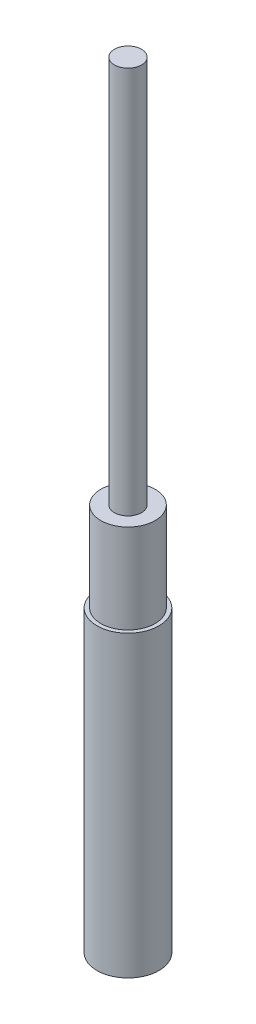
ISO-10303-21;
HEADER;
FILE_DESCRIPTION(('STEP AP214'),'2;1');
FILE_NAME('part.step','',(''),(''),'','','');
FILE_SCHEMA(('AUTOMOTIVE_DESIGN { 1 0 10303 214 1 1 1 1 }'));
ENDSEC;
DATA;
#1=APPLICATION_CONTEXT('core data for automotive mechanical design processes');
#2=APPLICATION_PROTOCOL_DEFINITION('international standard','automotive_design',2000,#1);
#3=PRODUCT_CONTEXT('',#1,'mechanical');
#4=PRODUCT('Part','Part','',(#3));
#5=PRODUCT_RELATED_PRODUCT_CATEGORY('part','',(#4));
#6=PRODUCT_DEFINITION_FORMATION('','',#4);
#7=PRODUCT_DEFINITION_CONTEXT('part definition',#1,'design');
#8=PRODUCT_DEFINITION('design','',#6,#7);
#9=PRODUCT_DEFINITION_SHAPE('','',#8);
#10=(LENGTH_UNIT() NAMED_UNIT(*) SI_UNIT(.MILLI.,.METRE.));
#11=(NAMED_UNIT(*) PLANE_ANGLE_UNIT() SI_UNIT($,.RADIAN.));
#12=(NAMED_UNIT(*) SI_UNIT($,.STERADIAN.) SOLID_ANGLE_UNIT());
#13=UNCERTAINTY_MEASURE_WITH_UNIT(LENGTH_MEASURE(1.E-05),#10,'distance_accuracy_value','');
#14=(GEOMETRIC_REPRESENTATION_CONTEXT(3) GLOBAL_UNCERTAINTY_ASSIGNED_CONTEXT((#13)) GLOBAL_UNIT_ASSIGNED_CONTEXT((#10,
#11,#12)) REPRESENTATION_CONTEXT('',''));
#15=CARTESIAN_POINT('',(0.,0.,0.));
#16=DIRECTION('',(0.,0.,1.));
#17=DIRECTION('',(1.,0.,0.));
#18=AXIS2_PLACEMENT_3D('',#15,#16,#17);
#19=CARTESIAN_POINT('',(0.,50.,0.));
#20=DIRECTION('',(0.,-1.,0.));
#21=DIRECTION('',(0.,0.,-1.));
#22=AXIS2_PLACEMENT_3D('',#19,#20,#21);
#23=CYLINDRICAL_SURFACE('',#22,4.);
#24=CARTESIAN_POINT('',(0.,0.,0.));
#25=DIRECTION('',(0.,1.,0.));
#26=DIRECTION('',(0.,0.,1.));
#27=AXIS2_PLACEMENT_3D('',#24,#25,#26);
#28=CIRCLE('',#27,4.);
#29=CARTESIAN_POINT('',(0.,0.,4.));
#30=VERTEX_POINT('',#29);
#31=EDGE_CURVE('E22',#30,#30,#28,.T.);
#32=ORIENTED_EDGE('',*,*,#31,.T.);
#33=EDGE_LOOP('',(#32));
#34=FACE_BOUND('',#33,.T.);
#35=CARTESIAN_POINT('',(0.,38.5,0.));
#36=DIRECTION('',(0.,1.,0.));
#37=DIRECTION('',(0.,0.,1.));
#38=AXIS2_PLACEMENT_3D('',#35,#36,#37);
#39=CIRCLE('',#38,4.);
#40=CARTESIAN_POINT('',(0.,38.5,4.));
#41=VERTEX_POINT('',#40);
#42=EDGE_CURVE('E18',#41,#41,#39,.T.);
#43=ORIENTED_EDGE('',*,*,#42,.F.);
#44=EDGE_LOOP('',(#43));
#45=FACE_BOUND('',#44,.T.);
#46=ADVANCED_FACE('F15',(#34,#45),#23,.T.);
#47=CARTESIAN_POINT('',(0.,0.,0.));
#48=DIRECTION('',(0.,1.,0.));
#49=DIRECTION('',(0.,0.,1.));
#50=AXIS2_PLACEMENT_3D('',#47,#48,#49);
#51=PLANE('',#50);
#52=ORIENTED_EDGE('',*,*,#31,.F.);
#53=EDGE_LOOP('',(#52));
#54=FACE_BOUND('',#53,.T.);
#55=ADVANCED_FACE('F58',(#54),#51,.F.);
#56=CARTESIAN_POINT('',(0.,38.5,0.));
#57=DIRECTION('',(0.,1.,0.));
#58=DIRECTION('',(0.,0.,1.));
#59=AXIS2_PLACEMENT_3D('',#56,#57,#58);
#60=PLANE('',#59);
#61=CARTESIAN_POINT('',(0.,38.5,0.));
#62=DIRECTION('',(0.,1.,0.));
#63=DIRECTION('',(0.,0.,1.));
#64=AXIS2_PLACEMENT_3D('',#61,#62,#63);
#65=CIRCLE('',#64,3.5);
#66=CARTESIAN_POINT('',(0.,38.5,3.5));
#67=VERTEX_POINT('',#66);
#68=EDGE_CURVE('E30',#67,#67,#65,.T.);
#69=ORIENTED_EDGE('',*,*,#68,.F.);
#70=EDGE_LOOP('',(#69));
#71=FACE_BOUND('',#70,.T.);
#72=ORIENTED_EDGE('',*,*,#42,.T.);
#73=EDGE_LOOP('',(#72));
#74=FACE_BOUND('',#73,.T.);
#75=ADVANCED_FACE('F64',(#71,#74),#60,.T.);
#76=CARTESIAN_POINT('',(0.,38.5,0.));
#77=DIRECTION('',(0.,1.,0.));
#78=DIRECTION('',(0.,0.,1.));
#79=AXIS2_PLACEMENT_3D('',#76,#77,#78);
#80=CYLINDRICAL_SURFACE('',#79,3.5);
#81=ORIENTED_EDGE('',*,*,#68,.T.);
#82=EDGE_LOOP('',(#81));
#83=FACE_BOUND('',#82,.T.);
#84=CARTESIAN_POINT('',(0.,50.,0.));
#85=DIRECTION('',(0.,1.,0.));
#86=DIRECTION('',(0.,0.,1.));
#87=AXIS2_PLACEMENT_3D('',#84,#85,#86);
#88=CIRCLE('',#87,3.5);
#89=CARTESIAN_POINT('',(0.,50.,3.5));
#90=VERTEX_POINT('',#89);
#91=EDGE_CURVE('E33',#90,#90,#88,.T.);
#92=ORIENTED_EDGE('',*,*,#91,.F.);
#93=EDGE_LOOP('',(#92));
#94=FACE_BOUND('',#93,.T.);
#95=ADVANCED_FACE('F53',(#83,#94),#80,.T.);
#96=CARTESIAN_POINT('',(0.,50.,0.));
#97=DIRECTION('',(0.,1.,0.));
#98=DIRECTION('',(0.,0.,1.));
#99=AXIS2_PLACEMENT_3D('',#96,#97,#98);
#100=PLANE('',#99);
#101=CARTESIAN_POINT('',(0.,50.,0.));
#102=DIRECTION('',(0.,1.,0.));
#103=DIRECTION('',(0.,0.,1.));
#104=AXIS2_PLACEMENT_3D('',#101,#102,#103);
#105=CIRCLE('',#104,1.75);
#106=CARTESIAN_POINT('',(0.,50.,1.75));
#107=VERTEX_POINT('',#106);
#108=EDGE_CURVE('E10',#107,#107,#105,.T.);
#109=ORIENTED_EDGE('',*,*,#108,.F.);
#110=EDGE_LOOP('',(#109));
#111=FACE_BOUND('',#110,.T.);
#112=ORIENTED_EDGE('',*,*,#91,.T.);
#113=EDGE_LOOP('',(#112));
#114=FACE_BOUND('',#113,.T.);
#115=ADVANCED_FACE('F44',(#111,#114),#100,.T.);
#116=CARTESIAN_POINT('',(0.,100.,0.));
#117=DIRECTION('',(0.,-1.,0.));
#118=DIRECTION('',(0.,0.,-1.));
#119=AXIS2_PLACEMENT_3D('',#116,#117,#118);
#120=CYLINDRICAL_SURFACE('',#119,1.75);
#121=CARTESIAN_POINT('',(0.,100.,0.));
#122=DIRECTION('',(0.,1.,0.));
#123=DIRECTION('',(0.,0.,1.));
#124=AXIS2_PLACEMENT_3D('',#121,#122,#123);
#125=CIRCLE('',#124,1.75);
#126=CARTESIAN_POINT('',(0.,100.,1.75));
#127=VERTEX_POINT('',#126);
#128=EDGE_CURVE('E29',#127,#127,#125,.T.);
#129=ORIENTED_EDGE('',*,*,#128,.F.);
#130=EDGE_LOOP('',(#129));
#131=FACE_BOUND('',#130,.T.);
#132=ORIENTED_EDGE('',*,*,#108,.T.);
#133=EDGE_LOOP('',(#132));
#134=FACE_BOUND('',#133,.T.);
#135=ADVANCED_FACE('F42',(#131,#134),#120,.T.);
#136=CARTESIAN_POINT('',(0.,100.,0.));
#137=DIRECTION('',(0.,1.,0.));
#138=DIRECTION('',(0.,0.,1.));
#139=AXIS2_PLACEMENT_3D('',#136,#137,#138);
#140=PLANE('',#139);
#141=ORIENTED_EDGE('',*,*,#128,.T.);
#142=EDGE_LOOP('',(#141));
#143=FACE_BOUND('',#142,.T.);
#144=ADVANCED_FACE('F40',(#143),#140,.T.);
#145=CLOSED_SHELL('',(#46,#55,#75,#95,#115,#135,#144));
#146=MANIFOLD_SOLID_BREP('B1',#145);
#147=ADVANCED_BREP_SHAPE_REPRESENTATION('',(#18,#146),#14);
#148=SHAPE_DEFINITION_REPRESENTATION(#9,#147);
ENDSEC;
END-ISO-10303-21;
